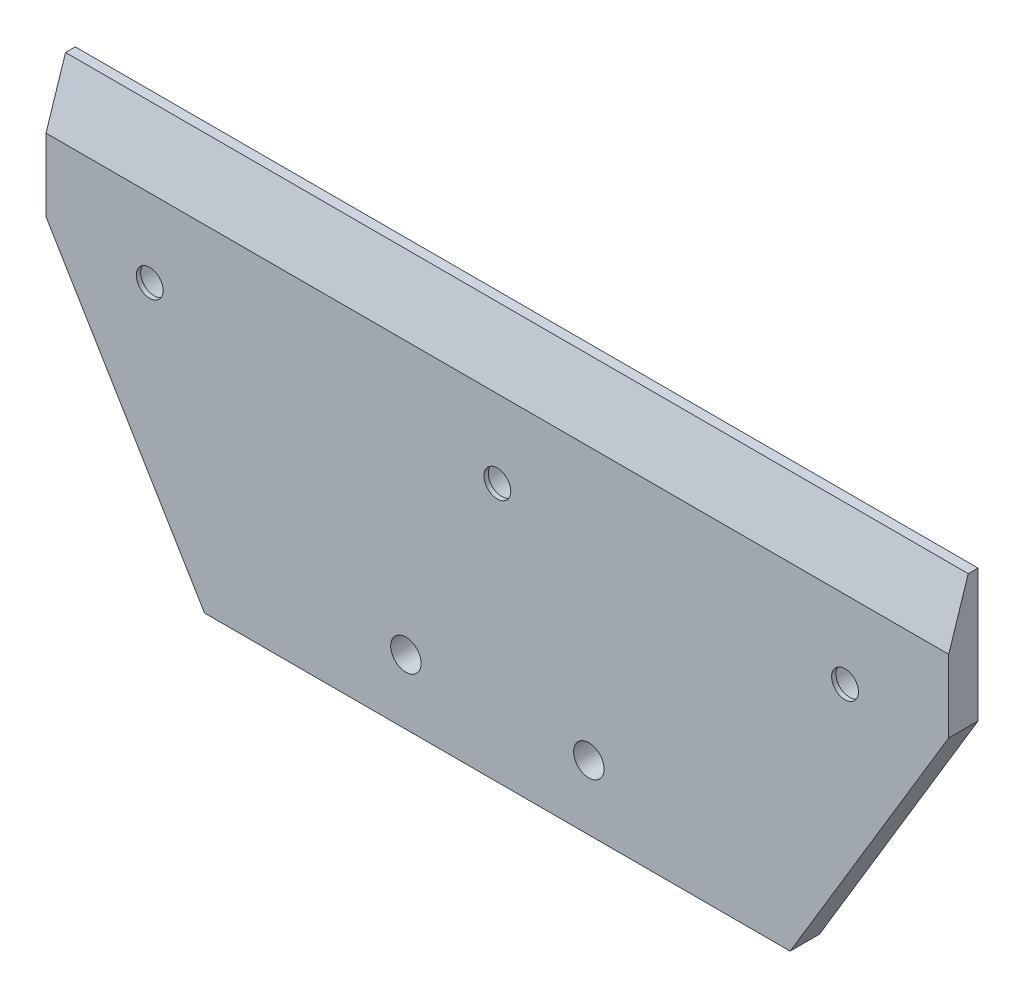
ISO-10303-21;
HEADER;
FILE_DESCRIPTION(('STEP AP214'),'2;1');
FILE_NAME('part.step','',(''),(''),'','','');
FILE_SCHEMA(('AUTOMOTIVE_DESIGN { 1 0 10303 214 1 1 1 1 }'));
ENDSEC;
DATA;
#1=APPLICATION_CONTEXT('core data for automotive mechanical design processes');
#2=APPLICATION_PROTOCOL_DEFINITION('international standard','automotive_design',2000,#1);
#3=PRODUCT_CONTEXT('',#1,'mechanical');
#4=PRODUCT('Part','Part','',(#3));
#5=PRODUCT_RELATED_PRODUCT_CATEGORY('part','',(#4));
#6=PRODUCT_DEFINITION_FORMATION('','',#4);
#7=PRODUCT_DEFINITION_CONTEXT('part definition',#1,'design');
#8=PRODUCT_DEFINITION('design','',#6,#7);
#9=PRODUCT_DEFINITION_SHAPE('','',#8);
#10=(LENGTH_UNIT() NAMED_UNIT(*) SI_UNIT(.MILLI.,.METRE.));
#11=(NAMED_UNIT(*) PLANE_ANGLE_UNIT() SI_UNIT($,.RADIAN.));
#12=(NAMED_UNIT(*) SI_UNIT($,.STERADIAN.) SOLID_ANGLE_UNIT());
#13=UNCERTAINTY_MEASURE_WITH_UNIT(LENGTH_MEASURE(1.E-05),#10,'distance_accuracy_value','');
#14=(GEOMETRIC_REPRESENTATION_CONTEXT(3) GLOBAL_UNCERTAINTY_ASSIGNED_CONTEXT((#13)) GLOBAL_UNIT_ASSIGNED_CONTEXT((#10,
#11,#12)) REPRESENTATION_CONTEXT('',''));
#15=CARTESIAN_POINT('',(0.,0.,0.));
#16=DIRECTION('',(0.,0.,1.));
#17=DIRECTION('',(1.,0.,0.));
#18=AXIS2_PLACEMENT_3D('',#15,#16,#17);
#19=CARTESIAN_POINT('',(0.,0.,-1.2));
#20=DIRECTION('',(0.,0.,1.));
#21=DIRECTION('',(1.,0.,0.));
#22=AXIS2_PLACEMENT_3D('',#19,#20,#21);
#23=PLANE('',#22);
#24=CARTESIAN_POINT('',(0.,21.2,-1.2));
#25=DIRECTION('',(0.,0.,-1.));
#26=DIRECTION('',(-1.,0.,0.));
#27=AXIS2_PLACEMENT_3D('',#24,#25,#26);
#28=CIRCLE('',#27,2.);
#29=CARTESIAN_POINT('',(-2.,21.2,-1.2));
#30=VERTEX_POINT('',#29);
#31=EDGE_CURVE('E385',#30,#30,#28,.T.);
#32=ORIENTED_EDGE('',*,*,#31,.F.);
#33=EDGE_LOOP('',(#32));
#34=FACE_BOUND('',#33,.T.);
#35=CARTESIAN_POINT('',(-28.5,21.2,-1.2));
#36=DIRECTION('',(0.,0.,-1.));
#37=DIRECTION('',(-1.,0.,0.));
#38=AXIS2_PLACEMENT_3D('',#35,#36,#37);
#39=CIRCLE('',#38,2.);
#40=CARTESIAN_POINT('',(-30.5,21.2,-1.2));
#41=VERTEX_POINT('',#40);
#42=EDGE_CURVE('E397',#41,#41,#39,.T.);
#43=ORIENTED_EDGE('',*,*,#42,.F.);
#44=EDGE_LOOP('',(#43));
#45=FACE_BOUND('',#44,.T.);
#46=CARTESIAN_POINT('',(-7.5,5.3,-1.2));
#47=DIRECTION('',(0.,0.,1.));
#48=DIRECTION('',(1.,0.,0.));
#49=AXIS2_PLACEMENT_3D('',#46,#47,#48);
#50=CIRCLE('',#49,1.25);
#51=CARTESIAN_POINT('',(-6.25,5.3,-1.2));
#52=VERTEX_POINT('',#51);
#53=EDGE_CURVE('E44',#52,#52,#50,.T.);
#54=ORIENTED_EDGE('',*,*,#53,.T.);
#55=EDGE_LOOP('',(#54));
#56=FACE_BOUND('',#55,.T.);
#57=CARTESIAN_POINT('',(7.5,5.3,-1.2));
#58=DIRECTION('',(0.,0.,1.));
#59=DIRECTION('',(1.,0.,0.));
#60=AXIS2_PLACEMENT_3D('',#57,#58,#59);
#61=CIRCLE('',#60,1.25);
#62=CARTESIAN_POINT('',(8.75,5.3,-1.2));
#63=VERTEX_POINT('',#62);
#64=EDGE_CURVE('E135',#63,#63,#61,.T.);
#65=ORIENTED_EDGE('',*,*,#64,.T.);
#66=EDGE_LOOP('',(#65));
#67=FACE_BOUND('',#66,.T.);
#68=DIRECTION('',(0.515038074910052,-0.857167300702114,0.));
#69=VECTOR('',#68,1.);
#70=CARTESIAN_POINT('',(-37.,21.6356332705569,-1.2));
#71=LINE('',#70,#69);
#72=CARTESIAN_POINT('',(-37.,21.6356332705569,-1.2));
#73=VERTEX_POINT('',#72);
#74=CARTESIAN_POINT('',(-24.,0.,-1.2));
#75=VERTEX_POINT('',#74);
#76=EDGE_CURVE('E114',#73,#75,#71,.T.);
#77=ORIENTED_EDGE('',*,*,#76,.F.);
#78=DIRECTION('',(0.,-1.,0.));
#79=VECTOR('',#78,1.);
#80=CARTESIAN_POINT('',(-37.,32.5,-1.2));
#81=LINE('',#80,#79);
#82=CARTESIAN_POINT('',(-37.,32.5,-1.2));
#83=VERTEX_POINT('',#82);
#84=EDGE_CURVE('E92',#83,#73,#81,.T.);
#85=ORIENTED_EDGE('',*,*,#84,.F.);
#86=DIRECTION('',(-1.,0.,0.));
#87=VECTOR('',#86,1.);
#88=CARTESIAN_POINT('',(37.,32.5,-1.2));
#89=LINE('',#88,#87);
#90=CARTESIAN_POINT('',(37.,32.5,-1.2));
#91=VERTEX_POINT('',#90);
#92=EDGE_CURVE('E123',#91,#83,#89,.T.);
#93=ORIENTED_EDGE('',*,*,#92,.F.);
#94=DIRECTION('',(0.,1.,0.));
#95=VECTOR('',#94,1.);
#96=CARTESIAN_POINT('',(37.,21.6356332705569,-1.2));
#97=LINE('',#96,#95);
#98=CARTESIAN_POINT('',(37.,21.6356332705569,-1.2));
#99=VERTEX_POINT('',#98);
#100=EDGE_CURVE('E166',#99,#91,#97,.T.);
#101=ORIENTED_EDGE('',*,*,#100,.F.);
#102=DIRECTION('',(0.515038074910052,0.857167300702114,0.));
#103=VECTOR('',#102,1.);
#104=CARTESIAN_POINT('',(24.,0.,-1.2));
#105=LINE('',#104,#103);
#106=CARTESIAN_POINT('',(24.,0.,-1.2));
#107=VERTEX_POINT('',#106);
#108=EDGE_CURVE('E164',#107,#99,#105,.T.);
#109=ORIENTED_EDGE('',*,*,#108,.F.);
#110=DIRECTION('',(1.,0.,0.));
#111=VECTOR('',#110,1.);
#112=CARTESIAN_POINT('',(-24.,0.,-1.2));
#113=LINE('',#112,#111);
#114=EDGE_CURVE('E162',#75,#107,#113,.T.);
#115=ORIENTED_EDGE('',*,*,#114,.F.);
#116=EDGE_LOOP('',(#77,#85,#93,#101,#109,#115));
#117=FACE_BOUND('',#116,.T.);
#118=CARTESIAN_POINT('',(28.5,21.2,-1.2));
#119=DIRECTION('',(0.,0.,-1.));
#120=DIRECTION('',(-1.,0.,0.));
#121=AXIS2_PLACEMENT_3D('',#118,#119,#120);
#122=CIRCLE('',#121,2.);
#123=CARTESIAN_POINT('',(26.5,21.2,-1.2));
#124=VERTEX_POINT('',#123);
#125=EDGE_CURVE('E375',#124,#124,#122,.T.);
#126=ORIENTED_EDGE('',*,*,#125,.F.);
#127=EDGE_LOOP('',(#126));
#128=FACE_BOUND('',#127,.T.);
#129=ADVANCED_FACE('F40',(#34,#45,#56,#67,#117,#128),#23,.F.);
#130=CARTESIAN_POINT('',(-37.,21.6356332705569,1.2));
#131=DIRECTION('',(0.857167300702114,0.515038074910052,0.));
#132=DIRECTION('',(-0.515038074910052,0.857167300702114,0.));
#133=AXIS2_PLACEMENT_3D('',#130,#131,#132);
#134=PLANE('',#133);
#135=ORIENTED_EDGE('',*,*,#76,.T.);
#136=DIRECTION('',(0.,0.,-1.));
#137=VECTOR('',#136,1.);
#138=CARTESIAN_POINT('',(-24.,0.,1.2));
#139=LINE('',#138,#137);
#140=CARTESIAN_POINT('',(-24.,0.,1.2));
#141=VERTEX_POINT('',#140);
#142=EDGE_CURVE('E11',#141,#75,#139,.T.);
#143=ORIENTED_EDGE('',*,*,#142,.F.);
#144=DIRECTION('',(0.515038074910052,-0.857167300702114,0.));
#145=VECTOR('',#144,1.);
#146=CARTESIAN_POINT('',(-37.,21.6356332705569,1.2));
#147=LINE('',#146,#145);
#148=CARTESIAN_POINT('',(-37.,21.6356332705569,1.2));
#149=VERTEX_POINT('',#148);
#150=EDGE_CURVE('E151',#149,#141,#147,.T.);
#151=ORIENTED_EDGE('',*,*,#150,.F.);
#152=DIRECTION('',(0.,0.,-1.));
#153=VECTOR('',#152,1.);
#154=CARTESIAN_POINT('',(-37.,21.6356332705569,1.2));
#155=LINE('',#154,#153);
#156=EDGE_CURVE('E125',#149,#73,#155,.T.);
#157=ORIENTED_EDGE('',*,*,#156,.T.);
#158=EDGE_LOOP('',(#135,#143,#151,#157));
#159=FACE_BOUND('',#158,.T.);
#160=ADVANCED_FACE('F42',(#159),#134,.F.);
#161=CARTESIAN_POINT('',(-24.,0.,1.2));
#162=DIRECTION('',(0.,1.,0.));
#163=DIRECTION('',(-1.,0.,0.));
#164=AXIS2_PLACEMENT_3D('',#161,#162,#163);
#165=PLANE('',#164);
#166=ORIENTED_EDGE('',*,*,#114,.T.);
#167=DIRECTION('',(0.,0.,-1.));
#168=VECTOR('',#167,1.);
#169=CARTESIAN_POINT('',(24.,0.,1.2));
#170=LINE('',#169,#168);
#171=CARTESIAN_POINT('',(24.,0.,1.2));
#172=VERTEX_POINT('',#171);
#173=EDGE_CURVE('E49',#172,#107,#170,.T.);
#174=ORIENTED_EDGE('',*,*,#173,.F.);
#175=DIRECTION('',(1.,0.,0.));
#176=VECTOR('',#175,1.);
#177=CARTESIAN_POINT('',(-24.,0.,1.2));
#178=LINE('',#177,#176);
#179=EDGE_CURVE('E99',#141,#172,#178,.T.);
#180=ORIENTED_EDGE('',*,*,#179,.F.);
#181=ORIENTED_EDGE('',*,*,#142,.T.);
#182=EDGE_LOOP('',(#166,#174,#180,#181));
#183=FACE_BOUND('',#182,.T.);
#184=ADVANCED_FACE('F183',(#183),#165,.F.);
#185=CARTESIAN_POINT('',(24.,0.,1.2));
#186=DIRECTION('',(-0.857167300702113,0.515038074910052,0.));
#187=DIRECTION('',(-0.515038074910052,-0.857167300702114,0.));
#188=AXIS2_PLACEMENT_3D('',#185,#186,#187);
#189=PLANE('',#188);
#190=ORIENTED_EDGE('',*,*,#108,.T.);
#191=DIRECTION('',(0.,0.,-1.));
#192=VECTOR('',#191,1.);
#193=CARTESIAN_POINT('',(37.,21.6356332705569,1.2));
#194=LINE('',#193,#192);
#195=CARTESIAN_POINT('',(37.,21.6356332705569,1.2));
#196=VERTEX_POINT('',#195);
#197=EDGE_CURVE('E127',#196,#99,#194,.T.);
#198=ORIENTED_EDGE('',*,*,#197,.F.);
#199=DIRECTION('',(0.515038074910052,0.857167300702114,0.));
#200=VECTOR('',#199,1.);
#201=CARTESIAN_POINT('',(24.,0.,1.2));
#202=LINE('',#201,#200);
#203=EDGE_CURVE('E154',#172,#196,#202,.T.);
#204=ORIENTED_EDGE('',*,*,#203,.F.);
#205=ORIENTED_EDGE('',*,*,#173,.T.);
#206=EDGE_LOOP('',(#190,#198,#204,#205));
#207=FACE_BOUND('',#206,.T.);
#208=ADVANCED_FACE('F185',(#207),#189,.F.);
#209=CARTESIAN_POINT('',(37.,21.6356332705569,1.2));
#210=DIRECTION('',(-1.,0.,0.));
#211=DIRECTION('',(0.,0.,1.));
#212=AXIS2_PLACEMENT_3D('',#209,#210,#211);
#213=PLANE('',#212);
#214=DIRECTION('',(0.,0.,-1.));
#215=VECTOR('',#214,1.);
#216=CARTESIAN_POINT('',(37.,32.5,1.2));
#217=LINE('',#216,#215);
#218=CARTESIAN_POINT('',(37.,32.5,-0.4));
#219=VERTEX_POINT('',#218);
#220=EDGE_CURVE('E124',#219,#91,#217,.T.);
#221=ORIENTED_EDGE('',*,*,#220,.F.);
#222=DIRECTION('',(0.,0.951056516295156,-0.309016994374941));
#223=VECTOR('',#222,1.);
#224=CARTESIAN_POINT('',(37.,27.5757063405195,1.2));
#225=LINE('',#224,#223);
#226=CARTESIAN_POINT('',(37.,27.5757063405195,1.2));
#227=VERTEX_POINT('',#226);
#228=EDGE_CURVE('E110',#227,#219,#225,.T.);
#229=ORIENTED_EDGE('',*,*,#228,.F.);
#230=DIRECTION('',(0.,1.,0.));
#231=VECTOR('',#230,1.);
#232=CARTESIAN_POINT('',(37.,21.6356332705569,1.2));
#233=LINE('',#232,#231);
#234=EDGE_CURVE('E156',#196,#227,#233,.T.);
#235=ORIENTED_EDGE('',*,*,#234,.F.);
#236=ORIENTED_EDGE('',*,*,#197,.T.);
#237=ORIENTED_EDGE('',*,*,#100,.T.);
#238=EDGE_LOOP('',(#221,#229,#235,#236,#237));
#239=FACE_BOUND('',#238,.T.);
#240=ADVANCED_FACE('F171',(#239),#213,.F.);
#241=CARTESIAN_POINT('',(37.,32.5,1.2));
#242=DIRECTION('',(0.,-1.,0.));
#243=DIRECTION('',(1.,0.,0.));
#244=AXIS2_PLACEMENT_3D('',#241,#242,#243);
#245=PLANE('',#244);
#246=DIRECTION('',(0.,0.,-1.));
#247=VECTOR('',#246,1.);
#248=CARTESIAN_POINT('',(-37.,32.5,1.2));
#249=LINE('',#248,#247);
#250=CARTESIAN_POINT('',(-37.,32.5,-0.4));
#251=VERTEX_POINT('',#250);
#252=EDGE_CURVE('E118',#251,#83,#249,.T.);
#253=ORIENTED_EDGE('',*,*,#252,.F.);
#254=DIRECTION('',(1.,0.,0.));
#255=VECTOR('',#254,1.);
#256=CARTESIAN_POINT('',(-37.,32.5,-0.4));
#257=LINE('',#256,#255);
#258=EDGE_CURVE('E107',#251,#219,#257,.T.);
#259=ORIENTED_EDGE('',*,*,#258,.T.);
#260=ORIENTED_EDGE('',*,*,#220,.T.);
#261=ORIENTED_EDGE('',*,*,#92,.T.);
#262=EDGE_LOOP('',(#253,#259,#260,#261));
#263=FACE_BOUND('',#262,.T.);
#264=ADVANCED_FACE('F121',(#263),#245,.F.);
#265=CARTESIAN_POINT('',(-37.,32.5,1.2));
#266=DIRECTION('',(1.,0.,0.));
#267=DIRECTION('',(0.,0.,-1.));
#268=AXIS2_PLACEMENT_3D('',#265,#266,#267);
#269=PLANE('',#268);
#270=DIRECTION('',(0.,-1.,0.));
#271=VECTOR('',#270,1.);
#272=CARTESIAN_POINT('',(-37.,32.5,1.2));
#273=LINE('',#272,#271);
#274=CARTESIAN_POINT('',(-37.,27.5757063405195,1.2));
#275=VERTEX_POINT('',#274);
#276=EDGE_CURVE('E65',#275,#149,#273,.T.);
#277=ORIENTED_EDGE('',*,*,#276,.F.);
#278=DIRECTION('',(0.,0.951056516295156,-0.309016994374941));
#279=VECTOR('',#278,1.);
#280=CARTESIAN_POINT('',(-37.,27.5757063405195,1.2));
#281=LINE('',#280,#279);
#282=EDGE_CURVE('E57',#275,#251,#281,.T.);
#283=ORIENTED_EDGE('',*,*,#282,.T.);
#284=ORIENTED_EDGE('',*,*,#252,.T.);
#285=ORIENTED_EDGE('',*,*,#84,.T.);
#286=ORIENTED_EDGE('',*,*,#156,.F.);
#287=EDGE_LOOP('',(#277,#283,#284,#285,#286));
#288=FACE_BOUND('',#287,.T.);
#289=ADVANCED_FACE('F117',(#288),#269,.F.);
#290=CARTESIAN_POINT('',(0.,0.,1.2));
#291=DIRECTION('',(0.,0.,1.));
#292=DIRECTION('',(1.,0.,0.));
#293=AXIS2_PLACEMENT_3D('',#290,#291,#292);
#294=PLANE('',#293);
#295=CARTESIAN_POINT('',(28.5,21.2,1.2));
#296=DIRECTION('',(0.,0.,1.));
#297=DIRECTION('',(1.,0.,0.));
#298=AXIS2_PLACEMENT_3D('',#295,#296,#297);
#299=CIRCLE('',#298,1.10000000000001);
#300=CARTESIAN_POINT('',(29.6,21.2,1.2));
#301=VERTEX_POINT('',#300);
#302=EDGE_CURVE('E382',#301,#301,#299,.T.);
#303=ORIENTED_EDGE('',*,*,#302,.F.);
#304=EDGE_LOOP('',(#303));
#305=FACE_BOUND('',#304,.T.);
#306=CARTESIAN_POINT('',(0.,21.2,1.2));
#307=DIRECTION('',(0.,0.,1.));
#308=DIRECTION('',(1.,0.,0.));
#309=AXIS2_PLACEMENT_3D('',#306,#307,#308);
#310=CIRCLE('',#309,1.10000000000001);
#311=CARTESIAN_POINT('',(1.10000000000001,21.2,1.2));
#312=VERTEX_POINT('',#311);
#313=EDGE_CURVE('E394',#312,#312,#310,.T.);
#314=ORIENTED_EDGE('',*,*,#313,.F.);
#315=EDGE_LOOP('',(#314));
#316=FACE_BOUND('',#315,.T.);
#317=CARTESIAN_POINT('',(-28.5,21.2,1.2));
#318=DIRECTION('',(0.,0.,1.));
#319=DIRECTION('',(1.,0.,0.));
#320=AXIS2_PLACEMENT_3D('',#317,#318,#319);
#321=CIRCLE('',#320,1.10000000000001);
#322=CARTESIAN_POINT('',(-27.4,21.2,1.2));
#323=VERTEX_POINT('',#322);
#324=EDGE_CURVE('E405',#323,#323,#321,.T.);
#325=ORIENTED_EDGE('',*,*,#324,.F.);
#326=EDGE_LOOP('',(#325));
#327=FACE_BOUND('',#326,.T.);
#328=CARTESIAN_POINT('',(-7.5,5.3,1.2));
#329=DIRECTION('',(0.,0.,1.));
#330=DIRECTION('',(1.,0.,0.));
#331=AXIS2_PLACEMENT_3D('',#328,#329,#330);
#332=CIRCLE('',#331,1.25);
#333=CARTESIAN_POINT('',(-6.25,5.3,1.2));
#334=VERTEX_POINT('',#333);
#335=EDGE_CURVE('E146',#334,#334,#332,.T.);
#336=ORIENTED_EDGE('',*,*,#335,.F.);
#337=EDGE_LOOP('',(#336));
#338=FACE_BOUND('',#337,.T.);
#339=CARTESIAN_POINT('',(7.5,5.3,1.2));
#340=DIRECTION('',(0.,0.,1.));
#341=DIRECTION('',(1.,0.,0.));
#342=AXIS2_PLACEMENT_3D('',#339,#340,#341);
#343=CIRCLE('',#342,1.25);
#344=CARTESIAN_POINT('',(8.75,5.3,1.2));
#345=VERTEX_POINT('',#344);
#346=EDGE_CURVE('E137',#345,#345,#343,.T.);
#347=ORIENTED_EDGE('',*,*,#346,.F.);
#348=EDGE_LOOP('',(#347));
#349=FACE_BOUND('',#348,.T.);
#350=DIRECTION('',(1.,0.,0.));
#351=VECTOR('',#350,1.);
#352=CARTESIAN_POINT('',(-37.,27.5757063405195,1.2));
#353=LINE('',#352,#351);
#354=EDGE_CURVE('E115',#275,#227,#353,.T.);
#355=ORIENTED_EDGE('',*,*,#354,.F.);
#356=ORIENTED_EDGE('',*,*,#276,.T.);
#357=ORIENTED_EDGE('',*,*,#150,.T.);
#358=ORIENTED_EDGE('',*,*,#179,.T.);
#359=ORIENTED_EDGE('',*,*,#203,.T.);
#360=ORIENTED_EDGE('',*,*,#234,.T.);
#361=EDGE_LOOP('',(#355,#356,#357,#358,#359,#360));
#362=FACE_BOUND('',#361,.T.);
#363=ADVANCED_FACE('F181',(#305,#316,#327,#338,#349,#362),#294,.T.);
#364=CARTESIAN_POINT('',(-37.,27.5757063405195,1.2));
#365=DIRECTION('',(0.,-0.309016994374941,-0.951056516295156));
#366=DIRECTION('',(0.,0.951056516295156,-0.309016994374941));
#367=AXIS2_PLACEMENT_3D('',#364,#365,#366);
#368=PLANE('',#367);
#369=ORIENTED_EDGE('',*,*,#228,.T.);
#370=ORIENTED_EDGE('',*,*,#258,.F.);
#371=ORIENTED_EDGE('',*,*,#282,.F.);
#372=ORIENTED_EDGE('',*,*,#354,.T.);
#373=EDGE_LOOP('',(#369,#370,#371,#372));
#374=FACE_BOUND('',#373,.T.);
#375=ADVANCED_FACE('F108',(#374),#368,.F.);
#376=CARTESIAN_POINT('',(7.5,5.3,1.2));
#377=DIRECTION('',(0.,0.,1.));
#378=DIRECTION('',(1.,0.,0.));
#379=AXIS2_PLACEMENT_3D('',#376,#377,#378);
#380=CYLINDRICAL_SURFACE('',#379,1.25);
#381=ORIENTED_EDGE('',*,*,#346,.T.);
#382=EDGE_LOOP('',(#381));
#383=FACE_BOUND('',#382,.T.);
#384=ORIENTED_EDGE('',*,*,#64,.F.);
#385=EDGE_LOOP('',(#384));
#386=FACE_BOUND('',#385,.T.);
#387=ADVANCED_FACE('F228',(#383,#386),#380,.F.);
#388=CARTESIAN_POINT('',(-7.5,5.3,1.2));
#389=DIRECTION('',(0.,0.,1.));
#390=DIRECTION('',(1.,0.,0.));
#391=AXIS2_PLACEMENT_3D('',#388,#389,#390);
#392=CYLINDRICAL_SURFACE('',#391,1.25);
#393=ORIENTED_EDGE('',*,*,#335,.T.);
#394=EDGE_LOOP('',(#393));
#395=FACE_BOUND('',#394,.T.);
#396=ORIENTED_EDGE('',*,*,#53,.F.);
#397=EDGE_LOOP('',(#396));
#398=FACE_BOUND('',#397,.T.);
#399=ADVANCED_FACE('F234',(#395,#398),#392,.F.);
#400=CARTESIAN_POINT('',(-28.5,21.2,-1.2));
#401=DIRECTION('',(0.,0.,-1.));
#402=DIRECTION('',(-1.,0.,0.));
#403=AXIS2_PLACEMENT_3D('',#400,#401,#402);
#404=CYLINDRICAL_SURFACE('',#403,1.10000000000001);
#405=CARTESIAN_POINT('',(-28.5,21.2,0.8407745571248));
#406=DIRECTION('',(0.,0.,-1.));
#407=DIRECTION('',(-1.,0.,0.));
#408=AXIS2_PLACEMENT_3D('',#405,#406,#407);
#409=CIRCLE('',#408,1.10000000000001);
#410=CARTESIAN_POINT('',(-29.6,21.2,0.8407745571248));
#411=VERTEX_POINT('',#410);
#412=EDGE_CURVE('E403',#411,#411,#409,.T.);
#413=ORIENTED_EDGE('',*,*,#412,.T.);
#414=EDGE_LOOP('',(#413));
#415=FACE_BOUND('',#414,.T.);
#416=ORIENTED_EDGE('',*,*,#324,.T.);
#417=EDGE_LOOP('',(#416));
#418=FACE_BOUND('',#417,.T.);
#419=ADVANCED_FACE('F241',(#415,#418),#404,.F.);
#420=CARTESIAN_POINT('',(-28.5,21.2,0.300000000000001));
#421=DIRECTION('',(0.,0.,-1.));
#422=DIRECTION('',(-1.,0.,0.));
#423=AXIS2_PLACEMENT_3D('',#420,#421,#422);
#424=CONICAL_SURFACE('',#423,2.,1.02974425867665);
#425=ORIENTED_EDGE('',*,*,#412,.F.);
#426=EDGE_LOOP('',(#425));
#427=FACE_BOUND('',#426,.T.);
#428=CARTESIAN_POINT('',(-28.5,21.2,0.300000000000001));
#429=DIRECTION('',(0.,0.,-1.));
#430=DIRECTION('',(-1.,0.,0.));
#431=AXIS2_PLACEMENT_3D('',#428,#429,#430);
#432=CIRCLE('',#431,2.);
#433=CARTESIAN_POINT('',(-30.5,21.2,0.300000000000001));
#434=VERTEX_POINT('',#433);
#435=EDGE_CURVE('E400',#434,#434,#432,.T.);
#436=ORIENTED_EDGE('',*,*,#435,.T.);
#437=EDGE_LOOP('',(#436));
#438=FACE_BOUND('',#437,.T.);
#439=ADVANCED_FACE('F248',(#427,#438),#424,.F.);
#440=CARTESIAN_POINT('',(-28.5,21.2,-1.2));
#441=DIRECTION('',(0.,0.,-1.));
#442=DIRECTION('',(-1.,0.,0.));
#443=AXIS2_PLACEMENT_3D('',#440,#441,#442);
#444=CYLINDRICAL_SURFACE('',#443,2.);
#445=ORIENTED_EDGE('',*,*,#435,.F.);
#446=EDGE_LOOP('',(#445));
#447=FACE_BOUND('',#446,.T.);
#448=ORIENTED_EDGE('',*,*,#42,.T.);
#449=EDGE_LOOP('',(#448));
#450=FACE_BOUND('',#449,.T.);
#451=ADVANCED_FACE('F256',(#447,#450),#444,.F.);
#452=CARTESIAN_POINT('',(0.,21.2,-1.2));
#453=DIRECTION('',(0.,0.,-1.));
#454=DIRECTION('',(-1.,0.,0.));
#455=AXIS2_PLACEMENT_3D('',#452,#453,#454);
#456=CYLINDRICAL_SURFACE('',#455,1.10000000000001);
#457=CARTESIAN_POINT('',(0.,21.2,0.8407745571248));
#458=DIRECTION('',(0.,0.,-1.));
#459=DIRECTION('',(-1.,0.,0.));
#460=AXIS2_PLACEMENT_3D('',#457,#458,#459);
#461=CIRCLE('',#460,1.10000000000001);
#462=CARTESIAN_POINT('',(-1.10000000000001,21.2,0.8407745571248));
#463=VERTEX_POINT('',#462);
#464=EDGE_CURVE('E391',#463,#463,#461,.T.);
#465=ORIENTED_EDGE('',*,*,#464,.T.);
#466=EDGE_LOOP('',(#465));
#467=FACE_BOUND('',#466,.T.);
#468=ORIENTED_EDGE('',*,*,#313,.T.);
#469=EDGE_LOOP('',(#468));
#470=FACE_BOUND('',#469,.T.);
#471=ADVANCED_FACE('F264',(#467,#470),#456,.F.);
#472=CARTESIAN_POINT('',(0.,21.2,0.300000000000001));
#473=DIRECTION('',(0.,0.,-1.));
#474=DIRECTION('',(-1.,0.,0.));
#475=AXIS2_PLACEMENT_3D('',#472,#473,#474);
#476=CONICAL_SURFACE('',#475,2.,1.02974425867665);
#477=ORIENTED_EDGE('',*,*,#464,.F.);
#478=EDGE_LOOP('',(#477));
#479=FACE_BOUND('',#478,.T.);
#480=CARTESIAN_POINT('',(0.,21.2,0.300000000000001));
#481=DIRECTION('',(0.,0.,-1.));
#482=DIRECTION('',(-1.,0.,0.));
#483=AXIS2_PLACEMENT_3D('',#480,#481,#482);
#484=CIRCLE('',#483,2.);
#485=CARTESIAN_POINT('',(-2.,21.2,0.300000000000001));
#486=VERTEX_POINT('',#485);
#487=EDGE_CURVE('E388',#486,#486,#484,.T.);
#488=ORIENTED_EDGE('',*,*,#487,.T.);
#489=EDGE_LOOP('',(#488));
#490=FACE_BOUND('',#489,.T.);
#491=ADVANCED_FACE('F272',(#479,#490),#476,.F.);
#492=CARTESIAN_POINT('',(0.,21.2,-1.2));
#493=DIRECTION('',(0.,0.,-1.));
#494=DIRECTION('',(-1.,0.,0.));
#495=AXIS2_PLACEMENT_3D('',#492,#493,#494);
#496=CYLINDRICAL_SURFACE('',#495,2.);
#497=ORIENTED_EDGE('',*,*,#487,.F.);
#498=EDGE_LOOP('',(#497));
#499=FACE_BOUND('',#498,.T.);
#500=ORIENTED_EDGE('',*,*,#31,.T.);
#501=EDGE_LOOP('',(#500));
#502=FACE_BOUND('',#501,.T.);
#503=ADVANCED_FACE('F280',(#499,#502),#496,.F.);
#504=CARTESIAN_POINT('',(28.5,21.2,-1.2));
#505=DIRECTION('',(0.,0.,-1.));
#506=DIRECTION('',(-1.,0.,0.));
#507=AXIS2_PLACEMENT_3D('',#504,#505,#506);
#508=CYLINDRICAL_SURFACE('',#507,1.10000000000001);
#509=CARTESIAN_POINT('',(28.5,21.2,0.8407745571248));
#510=DIRECTION('',(0.,0.,-1.));
#511=DIRECTION('',(-1.,0.,0.));
#512=AXIS2_PLACEMENT_3D('',#509,#510,#511);
#513=CIRCLE('',#512,1.10000000000001);
#514=CARTESIAN_POINT('',(27.4,21.2,0.8407745571248));
#515=VERTEX_POINT('',#514);
#516=EDGE_CURVE('E377',#515,#515,#513,.T.);
#517=ORIENTED_EDGE('',*,*,#516,.T.);
#518=EDGE_LOOP('',(#517));
#519=FACE_BOUND('',#518,.T.);
#520=ORIENTED_EDGE('',*,*,#302,.T.);
#521=EDGE_LOOP('',(#520));
#522=FACE_BOUND('',#521,.T.);
#523=ADVANCED_FACE('F288',(#519,#522),#508,.F.);
#524=CARTESIAN_POINT('',(28.5,21.2,0.300000000000001));
#525=DIRECTION('',(0.,0.,-1.));
#526=DIRECTION('',(-1.,0.,0.));
#527=AXIS2_PLACEMENT_3D('',#524,#525,#526);
#528=CONICAL_SURFACE('',#527,2.,1.02974425867665);
#529=ORIENTED_EDGE('',*,*,#516,.F.);
#530=EDGE_LOOP('',(#529));
#531=FACE_BOUND('',#530,.T.);
#532=CARTESIAN_POINT('',(28.5,21.2,0.300000000000001));
#533=DIRECTION('',(0.,0.,-1.));
#534=DIRECTION('',(-1.,0.,0.));
#535=AXIS2_PLACEMENT_3D('',#532,#533,#534);
#536=CIRCLE('',#535,2.);
#537=CARTESIAN_POINT('',(26.5,21.2,0.300000000000001));
#538=VERTEX_POINT('',#537);
#539=EDGE_CURVE('E372',#538,#538,#536,.T.);
#540=ORIENTED_EDGE('',*,*,#539,.T.);
#541=EDGE_LOOP('',(#540));
#542=FACE_BOUND('',#541,.T.);
#543=ADVANCED_FACE('F296',(#531,#542),#528,.F.);
#544=CARTESIAN_POINT('',(28.5,21.2,-1.2));
#545=DIRECTION('',(0.,0.,-1.));
#546=DIRECTION('',(-1.,0.,0.));
#547=AXIS2_PLACEMENT_3D('',#544,#545,#546);
#548=CYLINDRICAL_SURFACE('',#547,2.);
#549=ORIENTED_EDGE('',*,*,#539,.F.);
#550=EDGE_LOOP('',(#549));
#551=FACE_BOUND('',#550,.T.);
#552=ORIENTED_EDGE('',*,*,#125,.T.);
#553=EDGE_LOOP('',(#552));
#554=FACE_BOUND('',#553,.T.);
#555=ADVANCED_FACE('F304',(#551,#554),#548,.F.);
#556=CLOSED_SHELL('',(#129,#160,#184,#208,#240,#264,#289,#363,#375,#387,#399,#419,#439,#451,
#471,#491,#503,#523,#543,#555));
#557=MANIFOLD_SOLID_BREP('B2',#556);
#558=ADVANCED_BREP_SHAPE_REPRESENTATION('',(#18,#557),#14);
#559=SHAPE_DEFINITION_REPRESENTATION(#9,#558);
ENDSEC;
END-ISO-10303-21;
